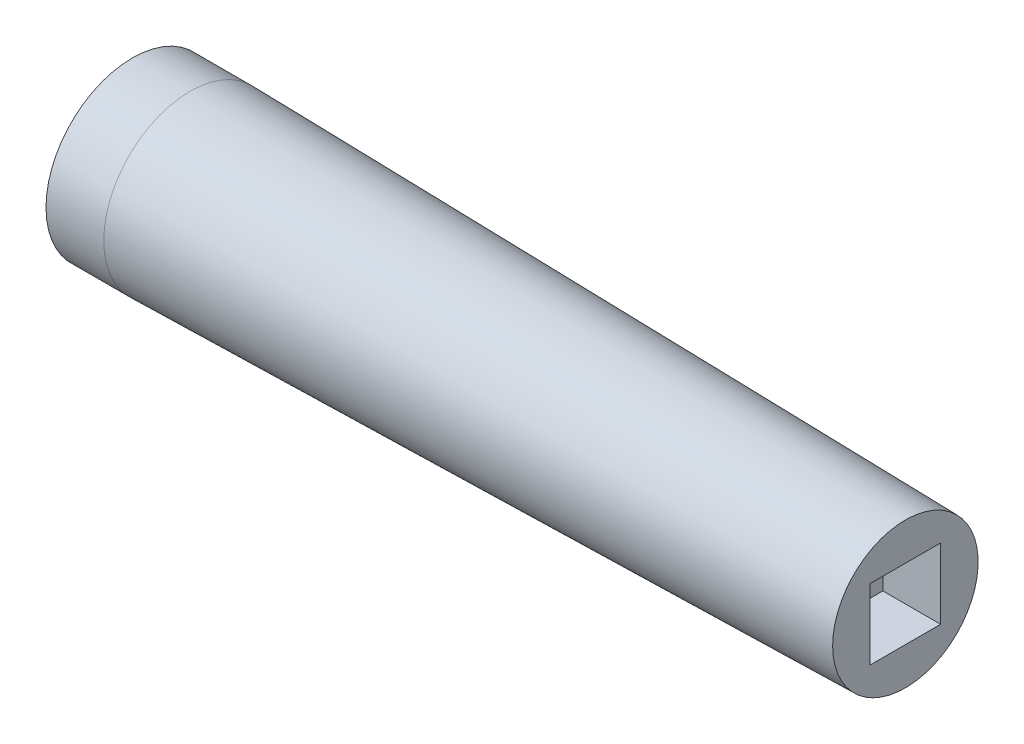
ISO-10303-21;
HEADER;
FILE_DESCRIPTION(('STEP AP214'),'2;1');
FILE_NAME('part.step','',(''),(''),'','','');
FILE_SCHEMA(('AUTOMOTIVE_DESIGN { 1 0 10303 214 1 1 1 1 }'));
ENDSEC;
DATA;
#1=APPLICATION_CONTEXT('core data for automotive mechanical design processes');
#2=APPLICATION_PROTOCOL_DEFINITION('international standard','automotive_design',2000,#1);
#3=PRODUCT_CONTEXT('',#1,'mechanical');
#4=PRODUCT('Part','Part','',(#3));
#5=PRODUCT_RELATED_PRODUCT_CATEGORY('part','',(#4));
#6=PRODUCT_DEFINITION_FORMATION('','',#4);
#7=PRODUCT_DEFINITION_CONTEXT('part definition',#1,'design');
#8=PRODUCT_DEFINITION('design','',#6,#7);
#9=PRODUCT_DEFINITION_SHAPE('','',#8);
#10=(LENGTH_UNIT() NAMED_UNIT(*) SI_UNIT(.MILLI.,.METRE.));
#11=(NAMED_UNIT(*) PLANE_ANGLE_UNIT() SI_UNIT($,.RADIAN.));
#12=(NAMED_UNIT(*) SI_UNIT($,.STERADIAN.) SOLID_ANGLE_UNIT());
#13=UNCERTAINTY_MEASURE_WITH_UNIT(LENGTH_MEASURE(1.E-05),#10,'distance_accuracy_value','');
#14=(GEOMETRIC_REPRESENTATION_CONTEXT(3) GLOBAL_UNCERTAINTY_ASSIGNED_CONTEXT((#13)) GLOBAL_UNIT_ASSIGNED_CONTEXT((#10,
#11,#12)) REPRESENTATION_CONTEXT('',''));
#15=CARTESIAN_POINT('',(0.,0.,0.));
#16=DIRECTION('',(0.,0.,1.));
#17=DIRECTION('',(1.,0.,0.));
#18=AXIS2_PLACEMENT_3D('',#15,#16,#17);
#19=CARTESIAN_POINT('',(170.,0.,0.));
#20=DIRECTION('',(-1.,0.,0.));
#21=DIRECTION('',(0.,0.,1.));
#22=AXIS2_PLACEMENT_3D('',#19,#20,#21);
#23=PLANE('',#22);
#24=CARTESIAN_POINT('',(170.,0.,0.));
#25=DIRECTION('',(-1.,0.,0.));
#26=DIRECTION('',(0.,0.,1.));
#27=AXIS2_PLACEMENT_3D('',#24,#25,#26);
#28=CIRCLE('',#27,16.);
#29=CARTESIAN_POINT('',(170.,0.,16.));
#30=VERTEX_POINT('',#29);
#31=EDGE_CURVE('E129',#30,#30,#28,.T.);
#32=ORIENTED_EDGE('',*,*,#31,.F.);
#33=EDGE_LOOP('',(#32));
#34=FACE_BOUND('',#33,.T.);
#35=DIRECTION('',(0.,1.,0.));
#36=VECTOR('',#35,1.);
#37=CARTESIAN_POINT('',(170.,0.,-7.75));
#38=LINE('',#37,#36);
#39=CARTESIAN_POINT('',(170.,-7.75,-7.75));
#40=VERTEX_POINT('',#39);
#41=CARTESIAN_POINT('',(170.,7.75,-7.75));
#42=VERTEX_POINT('',#41);
#43=EDGE_CURVE('E11',#40,#42,#38,.T.);
#44=ORIENTED_EDGE('',*,*,#43,.F.);
#45=DIRECTION('',(0.,0.,-1.));
#46=VECTOR('',#45,1.);
#47=CARTESIAN_POINT('',(170.,-7.75,0.));
#48=LINE('',#47,#46);
#49=CARTESIAN_POINT('',(170.,-7.75,7.75));
#50=VERTEX_POINT('',#49);
#51=EDGE_CURVE('E133',#50,#40,#48,.T.);
#52=ORIENTED_EDGE('',*,*,#51,.F.);
#53=DIRECTION('',(0.,-1.,0.));
#54=VECTOR('',#53,1.);
#55=CARTESIAN_POINT('',(170.,0.,7.75));
#56=LINE('',#55,#54);
#57=CARTESIAN_POINT('',(170.,7.75,7.75));
#58=VERTEX_POINT('',#57);
#59=EDGE_CURVE('E136',#58,#50,#56,.T.);
#60=ORIENTED_EDGE('',*,*,#59,.F.);
#61=DIRECTION('',(0.,0.,1.));
#62=VECTOR('',#61,1.);
#63=CARTESIAN_POINT('',(170.,7.75,0.));
#64=LINE('',#63,#62);
#65=EDGE_CURVE('E54',#42,#58,#64,.T.);
#66=ORIENTED_EDGE('',*,*,#65,.F.);
#67=EDGE_LOOP('',(#44,#52,#60,#66));
#68=FACE_BOUND('',#67,.T.);
#69=ADVANCED_FACE('F45',(#34,#68),#23,.F.);
#70=CARTESIAN_POINT('',(0.,19.,0.));
#71=DIRECTION('',(1.,0.,0.));
#72=DIRECTION('',(0.,0.,-1.));
#73=AXIS2_PLACEMENT_3D('',#70,#71,#72);
#74=PLANE('',#73);
#75=CARTESIAN_POINT('',(0.,0.,0.));
#76=DIRECTION('',(-1.,0.,0.));
#77=DIRECTION('',(0.,0.,1.));
#78=AXIS2_PLACEMENT_3D('',#75,#76,#77);
#79=CIRCLE('',#78,19.);
#80=CARTESIAN_POINT('',(0.,0.,19.));
#81=VERTEX_POINT('',#80);
#82=EDGE_CURVE('E93',#81,#81,#79,.T.);
#83=ORIENTED_EDGE('',*,*,#82,.T.);
#84=EDGE_LOOP('',(#83));
#85=FACE_BOUND('',#84,.T.);
#86=ADVANCED_FACE('F47',(#85),#74,.F.);
#87=CARTESIAN_POINT('',(170.,0.,0.));
#88=DIRECTION('',(-1.,0.,0.));
#89=DIRECTION('',(0.,0.,1.));
#90=AXIS2_PLACEMENT_3D('',#87,#88,#89);
#91=CONICAL_SURFACE('',#90,16.,0.0190695253934204);
#92=CARTESIAN_POINT('',(12.7,0.,0.));
#93=DIRECTION('',(-1.,0.,0.));
#94=DIRECTION('',(0.,0.,1.));
#95=AXIS2_PLACEMENT_3D('',#92,#93,#94);
#96=CIRCLE('',#95,19.);
#97=CARTESIAN_POINT('',(12.7,0.,19.));
#98=VERTEX_POINT('',#97);
#99=EDGE_CURVE('E125',#98,#98,#96,.T.);
#100=ORIENTED_EDGE('',*,*,#99,.F.);
#101=EDGE_LOOP('',(#100));
#102=FACE_BOUND('',#101,.T.);
#103=ORIENTED_EDGE('',*,*,#31,.T.);
#104=EDGE_LOOP('',(#103));
#105=FACE_BOUND('',#104,.T.);
#106=ADVANCED_FACE('F160',(#102,#105),#91,.T.);
#107=CARTESIAN_POINT('',(0.,0.,0.));
#108=DIRECTION('',(-1.,0.,0.));
#109=DIRECTION('',(0.,0.,1.));
#110=AXIS2_PLACEMENT_3D('',#107,#108,#109);
#111=CYLINDRICAL_SURFACE('',#110,19.);
#112=ORIENTED_EDGE('',*,*,#82,.F.);
#113=EDGE_LOOP('',(#112));
#114=FACE_BOUND('',#113,.T.);
#115=ORIENTED_EDGE('',*,*,#99,.T.);
#116=EDGE_LOOP('',(#115));
#117=FACE_BOUND('',#116,.T.);
#118=ADVANCED_FACE('F166',(#114,#117),#111,.T.);
#119=CARTESIAN_POINT('',(170.000012,7.75,-7.75));
#120=DIRECTION('',(0.,0.,1.));
#121=DIRECTION('',(0.,-1.,0.));
#122=AXIS2_PLACEMENT_3D('',#119,#120,#121);
#123=PLANE('',#122);
#124=ORIENTED_EDGE('',*,*,#43,.T.);
#125=DIRECTION('',(-1.,0.,0.));
#126=VECTOR('',#125,1.);
#127=CARTESIAN_POINT('',(170.000012,7.75,-7.75));
#128=LINE('',#127,#126);
#129=CARTESIAN_POINT('',(157.3,7.75,-7.75));
#130=VERTEX_POINT('',#129);
#131=EDGE_CURVE('E84',#42,#130,#128,.T.);
#132=ORIENTED_EDGE('',*,*,#131,.T.);
#133=DIRECTION('',(0.,1.,0.));
#134=VECTOR('',#133,1.);
#135=CARTESIAN_POINT('',(157.3,7.75,-7.75));
#136=LINE('',#135,#134);
#137=CARTESIAN_POINT('',(157.3,-7.75,-7.75));
#138=VERTEX_POINT('',#137);
#139=EDGE_CURVE('E88',#138,#130,#136,.T.);
#140=ORIENTED_EDGE('',*,*,#139,.F.);
#141=DIRECTION('',(-1.,0.,0.));
#142=VECTOR('',#141,1.);
#143=CARTESIAN_POINT('',(170.000012,-7.75,-7.75));
#144=LINE('',#143,#142);
#145=EDGE_CURVE('E115',#40,#138,#144,.T.);
#146=ORIENTED_EDGE('',*,*,#145,.F.);
#147=EDGE_LOOP('',(#124,#132,#140,#146));
#148=FACE_BOUND('',#147,.T.);
#149=ADVANCED_FACE('F86',(#148),#123,.T.);
#150=CARTESIAN_POINT('',(170.000012,7.75,7.75));
#151=DIRECTION('',(0.,-1.,0.));
#152=DIRECTION('',(0.,0.,-1.));
#153=AXIS2_PLACEMENT_3D('',#150,#151,#152);
#154=PLANE('',#153);
#155=ORIENTED_EDGE('',*,*,#65,.T.);
#156=DIRECTION('',(-1.,0.,0.));
#157=VECTOR('',#156,1.);
#158=CARTESIAN_POINT('',(170.000012,7.75,7.75));
#159=LINE('',#158,#157);
#160=CARTESIAN_POINT('',(157.3,7.75,7.75));
#161=VERTEX_POINT('',#160);
#162=EDGE_CURVE('E94',#58,#161,#159,.T.);
#163=ORIENTED_EDGE('',*,*,#162,.T.);
#164=DIRECTION('',(0.,0.,1.));
#165=VECTOR('',#164,1.);
#166=CARTESIAN_POINT('',(157.3,7.75,7.75));
#167=LINE('',#166,#165);
#168=EDGE_CURVE('E97',#130,#161,#167,.T.);
#169=ORIENTED_EDGE('',*,*,#168,.F.);
#170=ORIENTED_EDGE('',*,*,#131,.F.);
#171=EDGE_LOOP('',(#155,#163,#169,#170));
#172=FACE_BOUND('',#171,.T.);
#173=ADVANCED_FACE('F98',(#172),#154,.T.);
#174=CARTESIAN_POINT('',(170.000012,7.75,7.75));
#175=DIRECTION('',(0.,0.,-1.));
#176=DIRECTION('',(0.,1.,0.));
#177=AXIS2_PLACEMENT_3D('',#174,#175,#176);
#178=PLANE('',#177);
#179=ORIENTED_EDGE('',*,*,#59,.T.);
#180=DIRECTION('',(-1.,0.,0.));
#181=VECTOR('',#180,1.);
#182=CARTESIAN_POINT('',(170.000012,-7.75,7.75));
#183=LINE('',#182,#181);
#184=CARTESIAN_POINT('',(157.3,-7.75,7.75));
#185=VERTEX_POINT('',#184);
#186=EDGE_CURVE('E61',#50,#185,#183,.T.);
#187=ORIENTED_EDGE('',*,*,#186,.T.);
#188=DIRECTION('',(0.,-1.,0.));
#189=VECTOR('',#188,1.);
#190=CARTESIAN_POINT('',(157.3,7.75,7.75));
#191=LINE('',#190,#189);
#192=EDGE_CURVE('E104',#161,#185,#191,.T.);
#193=ORIENTED_EDGE('',*,*,#192,.F.);
#194=ORIENTED_EDGE('',*,*,#162,.F.);
#195=EDGE_LOOP('',(#179,#187,#193,#194));
#196=FACE_BOUND('',#195,.T.);
#197=ADVANCED_FACE('F142',(#196),#178,.T.);
#198=CARTESIAN_POINT('',(170.000012,-7.75,7.75));
#199=DIRECTION('',(0.,1.,0.));
#200=DIRECTION('',(0.,0.,1.));
#201=AXIS2_PLACEMENT_3D('',#198,#199,#200);
#202=PLANE('',#201);
#203=ORIENTED_EDGE('',*,*,#51,.T.);
#204=ORIENTED_EDGE('',*,*,#145,.T.);
#205=DIRECTION('',(0.,0.,-1.));
#206=VECTOR('',#205,1.);
#207=CARTESIAN_POINT('',(157.3,-7.75,7.75));
#208=LINE('',#207,#206);
#209=EDGE_CURVE('E107',#185,#138,#208,.T.);
#210=ORIENTED_EDGE('',*,*,#209,.F.);
#211=ORIENTED_EDGE('',*,*,#186,.F.);
#212=EDGE_LOOP('',(#203,#204,#210,#211));
#213=FACE_BOUND('',#212,.T.);
#214=ADVANCED_FACE('F144',(#213),#202,.T.);
#215=CARTESIAN_POINT('',(157.3,0.,0.));
#216=DIRECTION('',(1.,0.,0.));
#217=DIRECTION('',(0.,0.,-1.));
#218=AXIS2_PLACEMENT_3D('',#215,#216,#217);
#219=PLANE('',#218);
#220=ORIENTED_EDGE('',*,*,#139,.T.);
#221=ORIENTED_EDGE('',*,*,#168,.T.);
#222=ORIENTED_EDGE('',*,*,#192,.T.);
#223=ORIENTED_EDGE('',*,*,#209,.T.);
#224=EDGE_LOOP('',(#220,#221,#222,#223));
#225=FACE_BOUND('',#224,.T.);
#226=ADVANCED_FACE('F106',(#225),#219,.T.);
#227=CLOSED_SHELL('',(#69,#86,#106,#118,#149,#173,#197,#214,#226));
#228=MANIFOLD_SOLID_BREP('B2',#227);
#229=ADVANCED_BREP_SHAPE_REPRESENTATION('',(#18,#228),#14);
#230=SHAPE_DEFINITION_REPRESENTATION(#9,#229);
ENDSEC;
END-ISO-10303-21;
